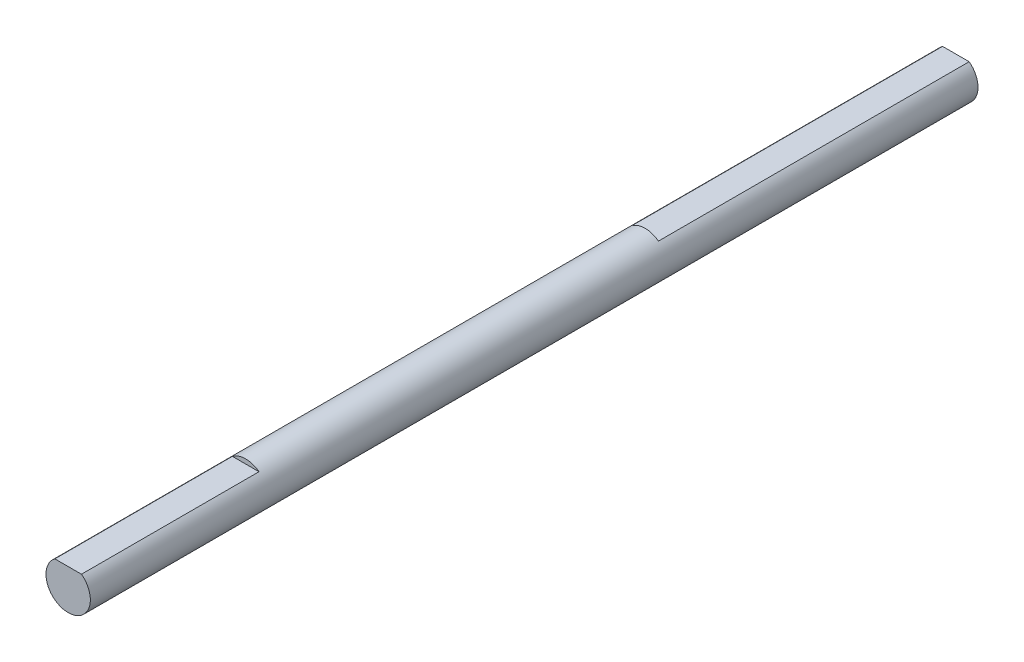
ISO-10303-21;
HEADER;
FILE_DESCRIPTION(('STEP AP214'),'2;1');
FILE_NAME('part.step','',(''),(''),'','','');
FILE_SCHEMA(('AUTOMOTIVE_DESIGN { 1 0 10303 214 1 1 1 1 }'));
ENDSEC;
DATA;
#1=APPLICATION_CONTEXT('core data for automotive mechanical design processes');
#2=APPLICATION_PROTOCOL_DEFINITION('international standard','automotive_design',2000,#1);
#3=PRODUCT_CONTEXT('',#1,'mechanical');
#4=PRODUCT('Part','Part','',(#3));
#5=PRODUCT_RELATED_PRODUCT_CATEGORY('part','',(#4));
#6=PRODUCT_DEFINITION_FORMATION('','',#4);
#7=PRODUCT_DEFINITION_CONTEXT('part definition',#1,'design');
#8=PRODUCT_DEFINITION('design','',#6,#7);
#9=PRODUCT_DEFINITION_SHAPE('','',#8);
#10=(LENGTH_UNIT() NAMED_UNIT(*) SI_UNIT(.MILLI.,.METRE.));
#11=(NAMED_UNIT(*) PLANE_ANGLE_UNIT() SI_UNIT($,.RADIAN.));
#12=(NAMED_UNIT(*) SI_UNIT($,.STERADIAN.) SOLID_ANGLE_UNIT());
#13=UNCERTAINTY_MEASURE_WITH_UNIT(LENGTH_MEASURE(1.E-05),#10,'distance_accuracy_value','');
#14=(GEOMETRIC_REPRESENTATION_CONTEXT(3) GLOBAL_UNCERTAINTY_ASSIGNED_CONTEXT((#13)) GLOBAL_UNIT_ASSIGNED_CONTEXT((#10,
#11,#12)) REPRESENTATION_CONTEXT('',''));
#15=CARTESIAN_POINT('',(0.,0.,0.));
#16=DIRECTION('',(0.,0.,1.));
#17=DIRECTION('',(1.,0.,0.));
#18=AXIS2_PLACEMENT_3D('',#15,#16,#17);
#19=CARTESIAN_POINT('',(0.,0.,-200.));
#20=DIRECTION('',(0.,0.,1.));
#21=DIRECTION('',(1.,0.,0.));
#22=AXIS2_PLACEMENT_3D('',#19,#20,#21);
#23=CYLINDRICAL_SURFACE('',#22,5.);
#24=DIRECTION('',(0.,0.,1.));
#25=VECTOR('',#24,1.);
#26=CARTESIAN_POINT('',(3.,4.,-200.));
#27=LINE('',#26,#25);
#28=CARTESIAN_POINT('',(3.,4.,0.));
#29=VERTEX_POINT('',#28);
#30=CARTESIAN_POINT('',(3.,4.,-39.9999999999999));
#31=VERTEX_POINT('',#30);
#32=EDGE_CURVE('E115',#29,#31,#27,.F.);
#33=ORIENTED_EDGE('',*,*,#32,.F.);
#34=CARTESIAN_POINT('',(0.,0.,0.));
#35=DIRECTION('',(0.,0.,1.));
#36=DIRECTION('',(1.,0.,0.));
#37=AXIS2_PLACEMENT_3D('',#34,#35,#36);
#38=CIRCLE('',#37,5.);
#39=CARTESIAN_POINT('',(-3.,4.,0.));
#40=VERTEX_POINT('',#39);
#41=EDGE_CURVE('E117',#40,#29,#38,.T.);
#42=ORIENTED_EDGE('',*,*,#41,.F.);
#43=DIRECTION('',(0.,0.,1.));
#44=VECTOR('',#43,1.);
#45=CARTESIAN_POINT('',(-3.,4.,-200.));
#46=LINE('',#45,#44);
#47=CARTESIAN_POINT('',(-3.,4.,-39.9999999999999));
#48=VERTEX_POINT('',#47);
#49=EDGE_CURVE('E79',#48,#40,#46,.T.);
#50=ORIENTED_EDGE('',*,*,#49,.F.);
#51=CARTESIAN_POINT('',(0.,0.,-39.9999999999999));
#52=DIRECTION('',(0.,0.,1.));
#53=DIRECTION('',(1.,0.,0.));
#54=AXIS2_PLACEMENT_3D('',#51,#52,#53);
#55=CIRCLE('',#54,5.);
#56=EDGE_CURVE('E123',#48,#31,#55,.F.);
#57=ORIENTED_EDGE('',*,*,#56,.T.);
#58=EDGE_LOOP('',(#33,#42,#50,#57));
#59=FACE_BOUND('',#58,.T.);
#60=CARTESIAN_POINT('',(0.,0.,-130.));
#61=DIRECTION('',(0.,0.,1.));
#62=DIRECTION('',(1.,0.,0.));
#63=AXIS2_PLACEMENT_3D('',#60,#61,#62);
#64=CIRCLE('',#63,5.);
#65=CARTESIAN_POINT('',(-3.,4.,-130.));
#66=VERTEX_POINT('',#65);
#67=CARTESIAN_POINT('',(3.,4.,-130.));
#68=VERTEX_POINT('',#67);
#69=EDGE_CURVE('E12',#66,#68,#64,.F.);
#70=ORIENTED_EDGE('',*,*,#69,.F.);
#71=DIRECTION('',(0.,0.,1.));
#72=VECTOR('',#71,1.);
#73=CARTESIAN_POINT('',(-3.,4.,-200.));
#74=LINE('',#73,#72);
#75=CARTESIAN_POINT('',(-3.,4.,-200.));
#76=VERTEX_POINT('',#75);
#77=EDGE_CURVE('E103',#66,#76,#74,.F.);
#78=ORIENTED_EDGE('',*,*,#77,.T.);
#79=CARTESIAN_POINT('',(0.,0.,-200.));
#80=DIRECTION('',(0.,0.,1.));
#81=DIRECTION('',(1.,0.,0.));
#82=AXIS2_PLACEMENT_3D('',#79,#80,#81);
#83=CIRCLE('',#82,5.);
#84=CARTESIAN_POINT('',(3.,4.,-200.));
#85=VERTEX_POINT('',#84);
#86=EDGE_CURVE('E107',#76,#85,#83,.T.);
#87=ORIENTED_EDGE('',*,*,#86,.T.);
#88=DIRECTION('',(0.,0.,1.));
#89=VECTOR('',#88,1.);
#90=CARTESIAN_POINT('',(3.,4.,-200.));
#91=LINE('',#90,#89);
#92=EDGE_CURVE('E71',#85,#68,#91,.T.);
#93=ORIENTED_EDGE('',*,*,#92,.T.);
#94=EDGE_LOOP('',(#70,#78,#87,#93));
#95=FACE_BOUND('',#94,.T.);
#96=ADVANCED_FACE('F57',(#59,#95),#23,.T.);
#97=CARTESIAN_POINT('',(0.,0.,-200.));
#98=DIRECTION('',(0.,0.,1.));
#99=DIRECTION('',(1.,0.,0.));
#100=AXIS2_PLACEMENT_3D('',#97,#98,#99);
#101=PLANE('',#100);
#102=DIRECTION('',(-1.,0.,0.));
#103=VECTOR('',#102,1.);
#104=CARTESIAN_POINT('',(0.,4.,-200.));
#105=LINE('',#104,#103);
#106=EDGE_CURVE('E64',#85,#76,#105,.T.);
#107=ORIENTED_EDGE('',*,*,#106,.F.);
#108=ORIENTED_EDGE('',*,*,#86,.F.);
#109=EDGE_LOOP('',(#107,#108));
#110=FACE_BOUND('',#109,.T.);
#111=ADVANCED_FACE('F126',(#110),#101,.F.);
#112=CARTESIAN_POINT('',(0.,0.,0.));
#113=DIRECTION('',(0.,0.,1.));
#114=DIRECTION('',(1.,0.,0.));
#115=AXIS2_PLACEMENT_3D('',#112,#113,#114);
#116=PLANE('',#115);
#117=DIRECTION('',(1.,0.,0.));
#118=VECTOR('',#117,1.);
#119=CARTESIAN_POINT('',(0.,4.,0.));
#120=LINE('',#119,#118);
#121=EDGE_CURVE('E119',#40,#29,#120,.T.);
#122=ORIENTED_EDGE('',*,*,#121,.F.);
#123=ORIENTED_EDGE('',*,*,#41,.T.);
#124=EDGE_LOOP('',(#122,#123));
#125=FACE_BOUND('',#124,.T.);
#126=ADVANCED_FACE('F128',(#125),#116,.T.);
#127=CARTESIAN_POINT('',(-10.,4.,-39.9999999999999));
#128=DIRECTION('',(0.,-1.,0.));
#129=DIRECTION('',(0.,0.,-1.));
#130=AXIS2_PLACEMENT_3D('',#127,#128,#129);
#131=PLANE('',#130);
#132=ORIENTED_EDGE('',*,*,#32,.T.);
#133=DIRECTION('',(1.,0.,0.));
#134=VECTOR('',#133,1.);
#135=CARTESIAN_POINT('',(-10.,4.,-39.9999999999999));
#136=LINE('',#135,#134);
#137=EDGE_CURVE('E109',#48,#31,#136,.T.);
#138=ORIENTED_EDGE('',*,*,#137,.F.);
#139=ORIENTED_EDGE('',*,*,#49,.T.);
#140=ORIENTED_EDGE('',*,*,#121,.T.);
#141=EDGE_LOOP('',(#132,#138,#139,#140));
#142=FACE_BOUND('',#141,.T.);
#143=ADVANCED_FACE('F134',(#142),#131,.F.);
#144=CARTESIAN_POINT('',(0.,0.,-39.9999999999999));
#145=DIRECTION('',(0.,0.,1.));
#146=DIRECTION('',(1.,0.,0.));
#147=AXIS2_PLACEMENT_3D('',#144,#145,#146);
#148=PLANE('',#147);
#149=ORIENTED_EDGE('',*,*,#137,.T.);
#150=ORIENTED_EDGE('',*,*,#56,.F.);
#151=EDGE_LOOP('',(#149,#150));
#152=FACE_BOUND('',#151,.T.);
#153=ADVANCED_FACE('F140',(#152),#148,.T.);
#154=CARTESIAN_POINT('',(10.,4.,-200.));
#155=DIRECTION('',(0.,1.,0.));
#156=DIRECTION('',(0.,0.,1.));
#157=AXIS2_PLACEMENT_3D('',#154,#155,#156);
#158=PLANE('',#157);
#159=DIRECTION('',(-1.,0.,0.));
#160=VECTOR('',#159,1.);
#161=CARTESIAN_POINT('',(10.,4.,-130.));
#162=LINE('',#161,#160);
#163=EDGE_CURVE('E99',#68,#66,#162,.T.);
#164=ORIENTED_EDGE('',*,*,#163,.F.);
#165=ORIENTED_EDGE('',*,*,#92,.F.);
#166=ORIENTED_EDGE('',*,*,#106,.T.);
#167=ORIENTED_EDGE('',*,*,#77,.F.);
#168=EDGE_LOOP('',(#164,#165,#166,#167));
#169=FACE_BOUND('',#168,.T.);
#170=ADVANCED_FACE('F102',(#169),#158,.T.);
#171=CARTESIAN_POINT('',(0.,0.,-130.));
#172=DIRECTION('',(0.,0.,1.));
#173=DIRECTION('',(1.,0.,0.));
#174=AXIS2_PLACEMENT_3D('',#171,#172,#173);
#175=PLANE('',#174);
#176=ORIENTED_EDGE('',*,*,#69,.T.);
#177=ORIENTED_EDGE('',*,*,#163,.T.);
#178=EDGE_LOOP('',(#176,#177));
#179=FACE_BOUND('',#178,.T.);
#180=ADVANCED_FACE('F98',(#179),#175,.F.);
#181=CLOSED_SHELL('',(#96,#111,#126,#143,#153,#170,#180));
#182=MANIFOLD_SOLID_BREP('B2',#181);
#183=ADVANCED_BREP_SHAPE_REPRESENTATION('',(#18,#182),#14);
#184=SHAPE_DEFINITION_REPRESENTATION(#9,#183);
ENDSEC;
END-ISO-10303-21;
